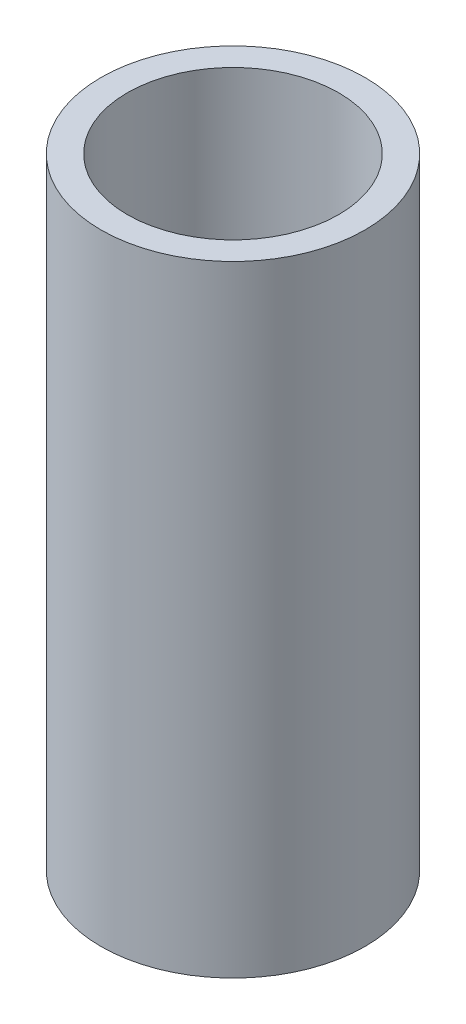
ISO-10303-21;
HEADER;
FILE_DESCRIPTION(('STEP AP214'),'2;1');
FILE_NAME('part.step','',(''),(''),'','','');
FILE_SCHEMA(('AUTOMOTIVE_DESIGN { 1 0 10303 214 1 1 1 1 }'));
ENDSEC;
DATA;
#1=APPLICATION_CONTEXT('core data for automotive mechanical design processes');
#2=APPLICATION_PROTOCOL_DEFINITION('international standard','automotive_design',2000,#1);
#3=PRODUCT_CONTEXT('',#1,'mechanical');
#4=PRODUCT('Part','Part','',(#3));
#5=PRODUCT_RELATED_PRODUCT_CATEGORY('part','',(#4));
#6=PRODUCT_DEFINITION_FORMATION('','',#4);
#7=PRODUCT_DEFINITION_CONTEXT('part definition',#1,'design');
#8=PRODUCT_DEFINITION('design','',#6,#7);
#9=PRODUCT_DEFINITION_SHAPE('','',#8);
#10=(LENGTH_UNIT() NAMED_UNIT(*) SI_UNIT(.MILLI.,.METRE.));
#11=(NAMED_UNIT(*) PLANE_ANGLE_UNIT() SI_UNIT($,.RADIAN.));
#12=(NAMED_UNIT(*) SI_UNIT($,.STERADIAN.) SOLID_ANGLE_UNIT());
#13=UNCERTAINTY_MEASURE_WITH_UNIT(LENGTH_MEASURE(1.E-05),#10,'distance_accuracy_value','');
#14=(GEOMETRIC_REPRESENTATION_CONTEXT(3) GLOBAL_UNCERTAINTY_ASSIGNED_CONTEXT((#13)) GLOBAL_UNIT_ASSIGNED_CONTEXT((#10,
#11,#12)) REPRESENTATION_CONTEXT('',''));
#15=CARTESIAN_POINT('',(0.,0.,0.));
#16=DIRECTION('',(0.,0.,1.));
#17=DIRECTION('',(1.,0.,0.));
#18=AXIS2_PLACEMENT_3D('',#15,#16,#17);
#19=CARTESIAN_POINT('',(0.,298.45,0.));
#20=DIRECTION('',(0.,1.,0.));
#21=DIRECTION('',(0.,0.,1.));
#22=AXIS2_PLACEMENT_3D('',#19,#20,#21);
#23=PLANE('',#22);
#24=CARTESIAN_POINT('',(0.,298.45,0.));
#25=DIRECTION('',(0.,1.,0.));
#26=DIRECTION('',(0.,0.,1.));
#27=AXIS2_PLACEMENT_3D('',#24,#25,#26);
#28=CIRCLE('',#27,63.5);
#29=CARTESIAN_POINT('',(0.,298.45,63.5));
#30=VERTEX_POINT('',#29);
#31=EDGE_CURVE('E10',#30,#30,#28,.T.);
#32=ORIENTED_EDGE('',*,*,#31,.T.);
#33=EDGE_LOOP('',(#32));
#34=FACE_BOUND('',#33,.T.);
#35=CARTESIAN_POINT('',(0.,298.45,0.));
#36=DIRECTION('',(0.,1.,0.));
#37=DIRECTION('',(0.,0.,1.));
#38=AXIS2_PLACEMENT_3D('',#35,#36,#37);
#39=CIRCLE('',#38,50.8);
#40=CARTESIAN_POINT('',(0.,298.45,50.8));
#41=VERTEX_POINT('',#40);
#42=EDGE_CURVE('E42',#41,#41,#39,.T.);
#43=ORIENTED_EDGE('',*,*,#42,.F.);
#44=EDGE_LOOP('',(#43));
#45=FACE_BOUND('',#44,.T.);
#46=ADVANCED_FACE('F31',(#34,#45),#23,.T.);
#47=CARTESIAN_POINT('',(0.,0.,0.));
#48=DIRECTION('',(0.,1.,0.));
#49=DIRECTION('',(0.,0.,1.));
#50=AXIS2_PLACEMENT_3D('',#47,#48,#49);
#51=PLANE('',#50);
#52=CARTESIAN_POINT('',(0.,0.,0.));
#53=DIRECTION('',(0.,1.,0.));
#54=DIRECTION('',(0.,0.,1.));
#55=AXIS2_PLACEMENT_3D('',#52,#53,#54);
#56=CIRCLE('',#55,63.5);
#57=CARTESIAN_POINT('',(0.,0.,63.5));
#58=VERTEX_POINT('',#57);
#59=EDGE_CURVE('E35',#58,#58,#56,.T.);
#60=ORIENTED_EDGE('',*,*,#59,.F.);
#61=EDGE_LOOP('',(#60));
#62=FACE_BOUND('',#61,.T.);
#63=CARTESIAN_POINT('',(0.,0.,0.));
#64=DIRECTION('',(0.,1.,0.));
#65=DIRECTION('',(0.,0.,1.));
#66=AXIS2_PLACEMENT_3D('',#63,#64,#65);
#67=CIRCLE('',#66,50.8);
#68=CARTESIAN_POINT('',(0.,0.,50.8));
#69=VERTEX_POINT('',#68);
#70=EDGE_CURVE('E44',#69,#69,#67,.T.);
#71=ORIENTED_EDGE('',*,*,#70,.T.);
#72=EDGE_LOOP('',(#71));
#73=FACE_BOUND('',#72,.T.);
#74=ADVANCED_FACE('F54',(#62,#73),#51,.F.);
#75=CARTESIAN_POINT('',(0.,298.45,0.));
#76=DIRECTION('',(0.,-1.,0.));
#77=DIRECTION('',(0.,0.,-1.));
#78=AXIS2_PLACEMENT_3D('',#75,#76,#77);
#79=CYLINDRICAL_SURFACE('',#78,63.5);
#80=ORIENTED_EDGE('',*,*,#31,.F.);
#81=EDGE_LOOP('',(#80));
#82=FACE_BOUND('',#81,.T.);
#83=ORIENTED_EDGE('',*,*,#59,.T.);
#84=EDGE_LOOP('',(#83));
#85=FACE_BOUND('',#84,.T.);
#86=ADVANCED_FACE('F33',(#82,#85),#79,.T.);
#87=CARTESIAN_POINT('',(0.,298.45,0.));
#88=DIRECTION('',(0.,-1.,0.));
#89=DIRECTION('',(0.,0.,-1.));
#90=AXIS2_PLACEMENT_3D('',#87,#88,#89);
#91=CYLINDRICAL_SURFACE('',#90,50.8);
#92=ORIENTED_EDGE('',*,*,#42,.T.);
#93=EDGE_LOOP('',(#92));
#94=FACE_BOUND('',#93,.T.);
#95=ORIENTED_EDGE('',*,*,#70,.F.);
#96=EDGE_LOOP('',(#95));
#97=FACE_BOUND('',#96,.T.);
#98=ADVANCED_FACE('F50',(#94,#97),#91,.F.);
#99=CLOSED_SHELL('',(#46,#74,#86,#98));
#100=MANIFOLD_SOLID_BREP('B2',#99);
#101=ADVANCED_BREP_SHAPE_REPRESENTATION('',(#18,#100),#14);
#102=SHAPE_DEFINITION_REPRESENTATION(#9,#101);
ENDSEC;
END-ISO-10303-21;
